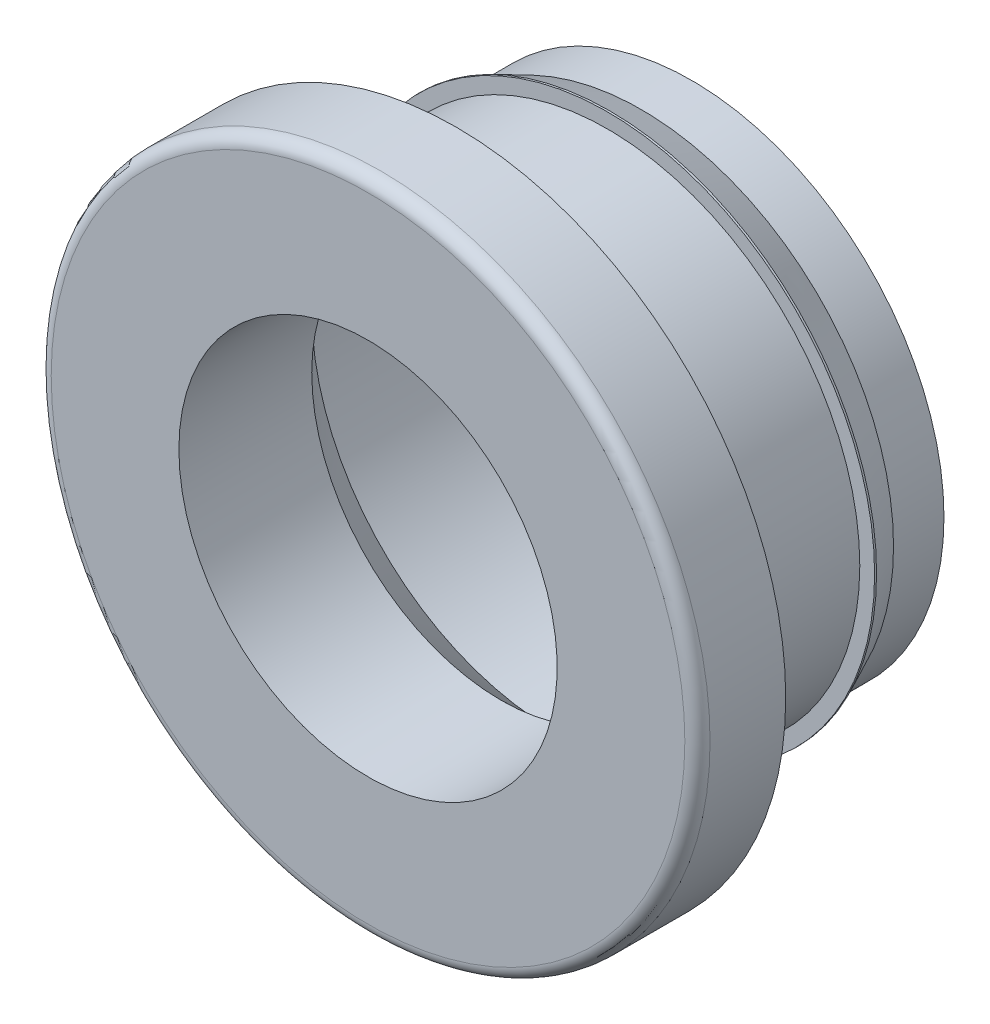
ISO-10303-21;
HEADER;
FILE_DESCRIPTION(('STEP AP214'),'2;1');
FILE_NAME('part.step','',(''),(''),'','','');
FILE_SCHEMA(('AUTOMOTIVE_DESIGN { 1 0 10303 214 1 1 1 1 }'));
ENDSEC;
DATA;
#1=APPLICATION_CONTEXT('core data for automotive mechanical design processes');
#2=APPLICATION_PROTOCOL_DEFINITION('international standard','automotive_design',2000,#1);
#3=PRODUCT_CONTEXT('',#1,'mechanical');
#4=PRODUCT('Part','Part','',(#3));
#5=PRODUCT_RELATED_PRODUCT_CATEGORY('part','',(#4));
#6=PRODUCT_DEFINITION_FORMATION('','',#4);
#7=PRODUCT_DEFINITION_CONTEXT('part definition',#1,'design');
#8=PRODUCT_DEFINITION('design','',#6,#7);
#9=PRODUCT_DEFINITION_SHAPE('','',#8);
#10=(LENGTH_UNIT() NAMED_UNIT(*) SI_UNIT(.MILLI.,.METRE.));
#11=(NAMED_UNIT(*) PLANE_ANGLE_UNIT() SI_UNIT($,.RADIAN.));
#12=(NAMED_UNIT(*) SI_UNIT($,.STERADIAN.) SOLID_ANGLE_UNIT());
#13=UNCERTAINTY_MEASURE_WITH_UNIT(LENGTH_MEASURE(1.E-05),#10,'distance_accuracy_value','');
#14=(GEOMETRIC_REPRESENTATION_CONTEXT(3) GLOBAL_UNCERTAINTY_ASSIGNED_CONTEXT((#13)) GLOBAL_UNIT_ASSIGNED_CONTEXT((#10,
#11,#12)) REPRESENTATION_CONTEXT('',''));
#15=CARTESIAN_POINT('',(0.,0.,0.));
#16=DIRECTION('',(0.,0.,1.));
#17=DIRECTION('',(1.,0.,0.));
#18=AXIS2_PLACEMENT_3D('',#15,#16,#17);
#19=CARTESIAN_POINT('',(0.,0.,8.5999999946356));
#20=DIRECTION('',(0.,0.,1.));
#21=DIRECTION('',(1.,0.,0.));
#22=AXIS2_PLACEMENT_3D('',#19,#20,#21);
#23=PLANE('',#22);
#24=CARTESIAN_POINT('',(0.,0.,8.5999999946356));
#25=DIRECTION('',(0.,0.,-1.));
#26=DIRECTION('',(1.,0.,0.));
#27=AXIS2_PLACEMENT_3D('',#24,#25,#26);
#28=CIRCLE('',#27,3.);
#29=CARTESIAN_POINT('',(-2.9999999999999,0.,8.59999999463564));
#30=VERTEX_POINT('',#29);
#31=EDGE_CURVE('E191',#30,#30,#28,.T.);
#32=ORIENTED_EDGE('',*,*,#31,.T.);
#33=EDGE_LOOP('',(#32));
#34=FACE_BOUND('',#33,.T.);
#35=CARTESIAN_POINT('',(0.,0.,8.5999999946356));
#36=DIRECTION('',(0.,0.,-1.));
#37=DIRECTION('',(-1.,0.,0.));
#38=AXIS2_PLACEMENT_3D('',#35,#36,#37);
#39=CIRCLE('',#38,5.025);
#40=CARTESIAN_POINT('',(-5.0249999999999,0.,8.59999999463566));
#41=VERTEX_POINT('',#40);
#42=EDGE_CURVE('E161',#41,#41,#39,.T.);
#43=ORIENTED_EDGE('',*,*,#42,.F.);
#44=EDGE_LOOP('',(#43));
#45=FACE_BOUND('',#44,.T.);
#46=ADVANCED_FACE('F17',(#34,#45),#23,.T.);
#47=CARTESIAN_POINT('',(0.,0.,4.7999999946356));
#48=DIRECTION('',(0.,0.,1.));
#49=DIRECTION('',(1.,0.,0.));
#50=AXIS2_PLACEMENT_3D('',#47,#48,#49);
#51=PLANE('',#50);
#52=CARTESIAN_POINT('',(0.,0.,4.79999999463559));
#53=DIRECTION('',(0.,0.,1.));
#54=DIRECTION('',(-1.,0.,0.));
#55=AXIS2_PLACEMENT_3D('',#52,#53,#54);
#56=CIRCLE('',#55,4.);
#57=CARTESIAN_POINT('',(4.00000000000006,0.,4.79999999463555));
#58=VERTEX_POINT('',#57);
#59=EDGE_CURVE('E154',#58,#58,#56,.T.);
#60=ORIENTED_EDGE('',*,*,#59,.F.);
#61=EDGE_LOOP('',(#60));
#62=FACE_BOUND('',#61,.T.);
#63=CARTESIAN_POINT('',(0.,0.,4.7999999946356));
#64=DIRECTION('',(0.,0.,1.));
#65=DIRECTION('',(-1.,0.,0.));
#66=AXIS2_PLACEMENT_3D('',#63,#64,#65);
#67=CIRCLE('',#66,4.235);
#68=CARTESIAN_POINT('',(4.235,0.,4.7999999946356));
#69=VERTEX_POINT('',#68);
#70=EDGE_CURVE('E127',#69,#69,#67,.T.);
#71=ORIENTED_EDGE('',*,*,#70,.T.);
#72=EDGE_LOOP('',(#71));
#73=FACE_BOUND('',#72,.T.);
#74=ADVANCED_FACE('F19',(#62,#73),#51,.T.);
#75=CARTESIAN_POINT('',(0.,0.,7.1999999946356));
#76=DIRECTION('',(0.,0.,1.));
#77=DIRECTION('',(1.,0.,0.));
#78=AXIS2_PLACEMENT_3D('',#75,#76,#77);
#79=PLANE('',#78);
#80=CARTESIAN_POINT('',(0.,0.,7.1999999946356));
#81=DIRECTION('',(0.,0.,-1.));
#82=DIRECTION('',(-1.,0.,0.));
#83=AXIS2_PLACEMENT_3D('',#80,#81,#82);
#84=CIRCLE('',#83,4.);
#85=CARTESIAN_POINT('',(4.00000000000008,0.,7.19999999463556));
#86=VERTEX_POINT('',#85);
#87=EDGE_CURVE('E121',#86,#86,#84,.T.);
#88=ORIENTED_EDGE('',*,*,#87,.F.);
#89=EDGE_LOOP('',(#88));
#90=FACE_BOUND('',#89,.T.);
#91=CARTESIAN_POINT('',(0.,0.,7.1999999946356));
#92=DIRECTION('',(0.,0.,1.));
#93=DIRECTION('',(1.,0.,0.));
#94=AXIS2_PLACEMENT_3D('',#91,#92,#93);
#95=CIRCLE('',#94,5.225);
#96=CARTESIAN_POINT('',(-5.22499999999992,0.,7.19999999463565));
#97=VERTEX_POINT('',#96);
#98=EDGE_CURVE('E106',#97,#97,#95,.T.);
#99=ORIENTED_EDGE('',*,*,#98,.F.);
#100=EDGE_LOOP('',(#99));
#101=FACE_BOUND('',#100,.T.);
#102=ADVANCED_FACE('F214',(#90,#101),#79,.F.);
#103=CARTESIAN_POINT('',(0.,0.,4.2649999946356));
#104=DIRECTION('',(0.,0.,-1.));
#105=DIRECTION('',(-1.,0.,0.));
#106=AXIS2_PLACEMENT_3D('',#103,#104,#105);
#107=CYLINDRICAL_SURFACE('',#106,4.);
#108=CARTESIAN_POINT('',(0.,0.,3.46499999463561));
#109=DIRECTION('',(0.,0.,1.));
#110=DIRECTION('',(-1.,0.,0.));
#111=AXIS2_PLACEMENT_3D('',#108,#109,#110);
#112=CIRCLE('',#111,4.);
#113=CARTESIAN_POINT('',(4.,0.,3.46499999463556));
#114=VERTEX_POINT('',#113);
#115=EDGE_CURVE('E188',#114,#114,#112,.T.);
#116=ORIENTED_EDGE('',*,*,#115,.T.);
#117=DIRECTION('',(0.,0.,1.));
#118=VECTOR('',#117,1.);
#119=CARTESIAN_POINT('',(4.00000000000005,0.,4.26499999463555));
#120=LINE('',#119,#118);
#121=CARTESIAN_POINT('',(3.9999999571592,0.,4.26500001460216));
#122=VERTEX_POINT('',#121);
#123=EDGE_CURVE('E11',#114,#122,#120,.T.);
#124=ORIENTED_EDGE('',*,*,#123,.T.);
#125=CARTESIAN_POINT('',(0.,0.,4.26500001460216));
#126=DIRECTION('',(0.,0.,1.));
#127=DIRECTION('',(1.,0.,0.));
#128=AXIS2_PLACEMENT_3D('',#125,#126,#127);
#129=CIRCLE('',#128,3.99999995715916);
#130=CARTESIAN_POINT('',(-3.99999995715912,0.,4.26500001460216));
#131=VERTEX_POINT('',#130);
#132=EDGE_CURVE('E132',#131,#122,#129,.T.);
#133=ORIENTED_EDGE('',*,*,#132,.F.);
#134=CARTESIAN_POINT('',(0.,0.,4.26500001460216));
#135=DIRECTION('',(0.,0.,1.));
#136=DIRECTION('',(1.,0.,0.));
#137=AXIS2_PLACEMENT_3D('',#134,#135,#136);
#138=CIRCLE('',#137,3.99999995715916);
#139=EDGE_CURVE('E26',#122,#131,#138,.T.);
#140=ORIENTED_EDGE('',*,*,#139,.F.);
#141=ORIENTED_EDGE('',*,*,#123,.F.);
#142=EDGE_LOOP('',(#116,#124,#133,#140,#141));
#143=FACE_BOUND('',#142,.T.);
#144=ADVANCED_FACE('F224',(#143),#107,.T.);
#145=CARTESIAN_POINT('',(0.,0.,4.76895923283781));
#146=DIRECTION('',(0.,0.,1.));
#147=DIRECTION('',(1.,0.,0.));
#148=AXIS2_PLACEMENT_3D('',#145,#146,#147);
#149=CONICAL_SURFACE('',#148,4.23500000002264,0.436332313002471);
#150=CARTESIAN_POINT('',(0.,0.,4.76895923283275));
#151=DIRECTION('',(0.,0.,1.));
#152=DIRECTION('',(-1.,0.,0.));
#153=AXIS2_PLACEMENT_3D('',#150,#151,#152);
#154=CIRCLE('',#153,4.235);
#155=CARTESIAN_POINT('',(-4.23500000002024,0.,4.76895923283275));
#156=VERTEX_POINT('',#155);
#157=CARTESIAN_POINT('',(4.235,0.,4.76895923283275));
#158=VERTEX_POINT('',#157);
#159=EDGE_CURVE('E112',#156,#158,#154,.T.);
#160=ORIENTED_EDGE('',*,*,#159,.F.);
#161=DIRECTION('',(0.422618261744224,0.,-0.906307787035006));
#162=VECTOR('',#161,1.);
#163=CARTESIAN_POINT('',(-4.2350000000226,0.,4.76895923283781));
#164=LINE('',#163,#162);
#165=EDGE_CURVE('E131',#156,#131,#164,.T.);
#166=ORIENTED_EDGE('',*,*,#165,.T.);
#167=ORIENTED_EDGE('',*,*,#132,.T.);
#168=ORIENTED_EDGE('',*,*,#139,.T.);
#169=ORIENTED_EDGE('',*,*,#165,.F.);
#170=CARTESIAN_POINT('',(0.,0.,4.76895923283275));
#171=DIRECTION('',(0.,0.,1.));
#172=DIRECTION('',(-1.,0.,0.));
#173=AXIS2_PLACEMENT_3D('',#170,#171,#172);
#174=CIRCLE('',#173,4.235);
#175=EDGE_CURVE('E128',#158,#156,#174,.T.);
#176=ORIENTED_EDGE('',*,*,#175,.F.);
#177=EDGE_LOOP('',(#160,#166,#167,#168,#169,#176));
#178=FACE_BOUND('',#177,.T.);
#179=ADVANCED_FACE('F220',(#178),#149,.T.);
#180=CARTESIAN_POINT('',(0.,0.,4.7999999946356));
#181=DIRECTION('',(0.,0.,-1.));
#182=DIRECTION('',(-1.,0.,0.));
#183=AXIS2_PLACEMENT_3D('',#180,#181,#182);
#184=CYLINDRICAL_SURFACE('',#183,4.235);
#185=ORIENTED_EDGE('',*,*,#159,.T.);
#186=DIRECTION('',(0.,0.,1.));
#187=VECTOR('',#186,1.);
#188=CARTESIAN_POINT('',(4.235,0.,4.7999999946356));
#189=LINE('',#188,#187);
#190=EDGE_CURVE('E119',#158,#69,#189,.T.);
#191=ORIENTED_EDGE('',*,*,#190,.T.);
#192=ORIENTED_EDGE('',*,*,#70,.F.);
#193=ORIENTED_EDGE('',*,*,#190,.F.);
#194=ORIENTED_EDGE('',*,*,#175,.T.);
#195=EDGE_LOOP('',(#185,#191,#192,#193,#194));
#196=FACE_BOUND('',#195,.T.);
#197=ADVANCED_FACE('F223',(#196),#184,.T.);
#198=CARTESIAN_POINT('',(0.,0.,7.5999999946356));
#199=DIRECTION('',(0.,0.,1.));
#200=DIRECTION('',(1.,0.,0.));
#201=AXIS2_PLACEMENT_3D('',#198,#199,#200);
#202=CYLINDRICAL_SURFACE('',#201,5.225);
#203=CARTESIAN_POINT('',(0.,0.,8.39999999463561));
#204=DIRECTION('',(0.,0.,-1.));
#205=DIRECTION('',(1.,0.,0.));
#206=AXIS2_PLACEMENT_3D('',#203,#204,#205);
#207=CIRCLE('',#206,5.225);
#208=CARTESIAN_POINT('',(-5.22499999999991,0.,8.39999999463566));
#209=VERTEX_POINT('',#208);
#210=EDGE_CURVE('E185',#209,#209,#207,.T.);
#211=ORIENTED_EDGE('',*,*,#210,.T.);
#212=DIRECTION('',(0.,0.,-1.));
#213=VECTOR('',#212,1.);
#214=CARTESIAN_POINT('',(-5.22499999999991,0.,7.59999999463565));
#215=LINE('',#214,#213);
#216=EDGE_CURVE('E109',#209,#97,#215,.T.);
#217=ORIENTED_EDGE('',*,*,#216,.T.);
#218=ORIENTED_EDGE('',*,*,#98,.T.);
#219=ORIENTED_EDGE('',*,*,#216,.F.);
#220=EDGE_LOOP('',(#211,#217,#218,#219));
#221=FACE_BOUND('',#220,.T.);
#222=ADVANCED_FACE('F108',(#221),#202,.T.);
#223=CARTESIAN_POINT('',(0.,0.,7.5999999946356));
#224=DIRECTION('',(0.,0.,-1.));
#225=DIRECTION('',(-1.,0.,0.));
#226=AXIS2_PLACEMENT_3D('',#223,#224,#225);
#227=CYLINDRICAL_SURFACE('',#226,4.);
#228=ORIENTED_EDGE('',*,*,#59,.T.);
#229=DIRECTION('',(0.,0.,1.));
#230=VECTOR('',#229,1.);
#231=CARTESIAN_POINT('',(4.00000000000009,0.,7.59999999463556));
#232=LINE('',#231,#230);
#233=EDGE_CURVE('E145',#58,#86,#232,.T.);
#234=ORIENTED_EDGE('',*,*,#233,.T.);
#235=ORIENTED_EDGE('',*,*,#87,.T.);
#236=ORIENTED_EDGE('',*,*,#233,.F.);
#237=EDGE_LOOP('',(#228,#234,#235,#236));
#238=FACE_BOUND('',#237,.T.);
#239=ADVANCED_FACE('F218',(#238),#227,.T.);
#240=CARTESIAN_POINT('',(0.,0.,8.3999999946356));
#241=DIRECTION('',(0.,0.,1.));
#242=DIRECTION('',(1.,0.,0.));
#243=AXIS2_PLACEMENT_3D('',#240,#241,#242);
#244=TOROIDAL_SURFACE('',#243,5.025,0.2);
#245=ORIENTED_EDGE('',*,*,#42,.T.);
#246=CARTESIAN_POINT('',(-5.02499999999991,0.,8.39999999463566));
#247=DIRECTION('',(0.,-1.,0.));
#248=DIRECTION('',(-1.,0.,0.));
#249=AXIS2_PLACEMENT_3D('',#246,#247,#248);
#250=CIRCLE('',#249,0.2);
#251=EDGE_CURVE('E165',#41,#209,#250,.T.);
#252=ORIENTED_EDGE('',*,*,#251,.T.);
#253=ORIENTED_EDGE('',*,*,#210,.F.);
#254=ORIENTED_EDGE('',*,*,#251,.F.);
#255=EDGE_LOOP('',(#245,#252,#253,#254));
#256=FACE_BOUND('',#255,.T.);
#257=ADVANCED_FACE('F203',(#256),#244,.T.);
#258=CARTESIAN_POINT('',(0.,0.,6.5999999946356));
#259=DIRECTION('',(0.,0.,-1.));
#260=DIRECTION('',(1.,0.,0.));
#261=AXIS2_PLACEMENT_3D('',#258,#259,#260);
#262=CYLINDRICAL_SURFACE('',#261,3.);
#263=ORIENTED_EDGE('',*,*,#31,.F.);
#264=DIRECTION('',(0.,0.,-1.));
#265=VECTOR('',#264,1.);
#266=CARTESIAN_POINT('',(-2.99999999999993,0.,6.59999999463564));
#267=LINE('',#266,#265);
#268=CARTESIAN_POINT('',(-2.99999999999993,0.,6.49289321344909));
#269=VERTEX_POINT('',#268);
#270=EDGE_CURVE('E166',#30,#269,#267,.T.);
#271=ORIENTED_EDGE('',*,*,#270,.T.);
#272=CARTESIAN_POINT('',(0.,0.,6.49289321344906));
#273=DIRECTION('',(0.,0.,-1.));
#274=DIRECTION('',(1.,0.,0.));
#275=AXIS2_PLACEMENT_3D('',#272,#273,#274);
#276=CIRCLE('',#275,3.);
#277=CARTESIAN_POINT('',(3.00000000000008,0.,6.49289321344903));
#278=VERTEX_POINT('',#277);
#279=EDGE_CURVE('E146',#269,#278,#276,.T.);
#280=ORIENTED_EDGE('',*,*,#279,.T.);
#281=CARTESIAN_POINT('',(0.,0.,6.49289321344906));
#282=DIRECTION('',(0.,0.,-1.));
#283=DIRECTION('',(1.,0.,0.));
#284=AXIS2_PLACEMENT_3D('',#281,#282,#283);
#285=CIRCLE('',#284,3.);
#286=EDGE_CURVE('E150',#278,#269,#285,.T.);
#287=ORIENTED_EDGE('',*,*,#286,.T.);
#288=ORIENTED_EDGE('',*,*,#270,.F.);
#289=EDGE_LOOP('',(#263,#271,#280,#287,#288));
#290=FACE_BOUND('',#289,.T.);
#291=ADVANCED_FACE('F250',(#290),#262,.F.);
#292=CARTESIAN_POINT('',(0.,0.,3.4649999946356));
#293=DIRECTION('',(0.,0.,-1.));
#294=DIRECTION('',(-1.,0.,0.));
#295=AXIS2_PLACEMENT_3D('',#292,#293,#294);
#296=PLANE('',#295);
#297=CARTESIAN_POINT('',(0.,0.,3.4649999946356));
#298=DIRECTION('',(0.,0.,1.));
#299=DIRECTION('',(1.,0.,0.));
#300=AXIS2_PLACEMENT_3D('',#297,#298,#299);
#301=CIRCLE('',#300,3.85);
#302=CARTESIAN_POINT('',(-3.85,0.,3.46499999463565));
#303=VERTEX_POINT('',#302);
#304=EDGE_CURVE('E175',#303,#303,#301,.T.);
#305=ORIENTED_EDGE('',*,*,#304,.T.);
#306=EDGE_LOOP('',(#305));
#307=FACE_BOUND('',#306,.T.);
#308=ORIENTED_EDGE('',*,*,#115,.F.);
#309=EDGE_LOOP('',(#308));
#310=FACE_BOUND('',#309,.T.);
#311=ADVANCED_FACE('F247',(#307,#310),#296,.T.);
#312=CARTESIAN_POINT('',(0.,0.,3.4649999946356));
#313=DIRECTION('',(0.,0.,1.));
#314=DIRECTION('',(1.,0.,0.));
#315=AXIS2_PLACEMENT_3D('',#312,#313,#314);
#316=CYLINDRICAL_SURFACE('',#315,3.85);
#317=ORIENTED_EDGE('',*,*,#304,.F.);
#318=DIRECTION('',(0.,0.,1.));
#319=VECTOR('',#318,1.);
#320=CARTESIAN_POINT('',(-3.85,0.,3.46499999463565));
#321=LINE('',#320,#319);
#322=CARTESIAN_POINT('',(-3.84999999999993,0.,5.6428932134491));
#323=VERTEX_POINT('',#322);
#324=EDGE_CURVE('E178',#303,#323,#321,.T.);
#325=ORIENTED_EDGE('',*,*,#324,.T.);
#326=CARTESIAN_POINT('',(0.,0.,5.64289321344906));
#327=DIRECTION('',(0.,0.,-1.));
#328=DIRECTION('',(1.,0.,0.));
#329=AXIS2_PLACEMENT_3D('',#326,#327,#328);
#330=CIRCLE('',#329,3.85);
#331=CARTESIAN_POINT('',(3.85000000000007,0.,5.64289321344901));
#332=VERTEX_POINT('',#331);
#333=EDGE_CURVE('E170',#332,#323,#330,.T.);
#334=ORIENTED_EDGE('',*,*,#333,.F.);
#335=CARTESIAN_POINT('',(0.,0.,5.64289321344906));
#336=DIRECTION('',(0.,0.,-1.));
#337=DIRECTION('',(1.,0.,0.));
#338=AXIS2_PLACEMENT_3D('',#335,#336,#337);
#339=CIRCLE('',#338,3.85);
#340=EDGE_CURVE('E174',#323,#332,#339,.T.);
#341=ORIENTED_EDGE('',*,*,#340,.F.);
#342=ORIENTED_EDGE('',*,*,#324,.F.);
#343=EDGE_LOOP('',(#317,#325,#334,#341,#342));
#344=FACE_BOUND('',#343,.T.);
#345=ADVANCED_FACE('F257',(#344),#316,.F.);
#346=CARTESIAN_POINT('',(0.,0.,6.42144660404233));
#347=DIRECTION('',(0.,0.,-1.));
#348=DIRECTION('',(-1.,0.,0.));
#349=AXIS2_PLACEMENT_3D('',#346,#347,#348);
#350=CONICAL_SURFACE('',#349,3.07144660940673,0.785398163397449);
#351=ORIENTED_EDGE('',*,*,#279,.F.);
#352=ORIENTED_EDGE('',*,*,#286,.F.);
#353=DIRECTION('',(0.707106781186539,0.,-0.707106781186556));
#354=VECTOR('',#353,1.);
#355=CARTESIAN_POINT('',(3.07144660940681,0.,6.42144660404229));
#356=LINE('',#355,#354);
#357=EDGE_CURVE('E158',#278,#332,#356,.T.);
#358=ORIENTED_EDGE('',*,*,#357,.T.);
#359=ORIENTED_EDGE('',*,*,#333,.T.);
#360=ORIENTED_EDGE('',*,*,#340,.T.);
#361=ORIENTED_EDGE('',*,*,#357,.F.);
#362=EDGE_LOOP('',(#351,#352,#358,#359,#360,#361));
#363=FACE_BOUND('',#362,.T.);
#364=ADVANCED_FACE('F263',(#363),#350,.F.);
#365=CLOSED_SHELL('',(#46,#74,#102,#144,#179,#197,#222,#239,#257,#291,#311,#345,#364));
#366=MANIFOLD_SOLID_BREP('B1',#365);
#367=ADVANCED_BREP_SHAPE_REPRESENTATION('',(#18,#366),#14);
#368=SHAPE_DEFINITION_REPRESENTATION(#9,#367);
ENDSEC;
END-ISO-10303-21;
